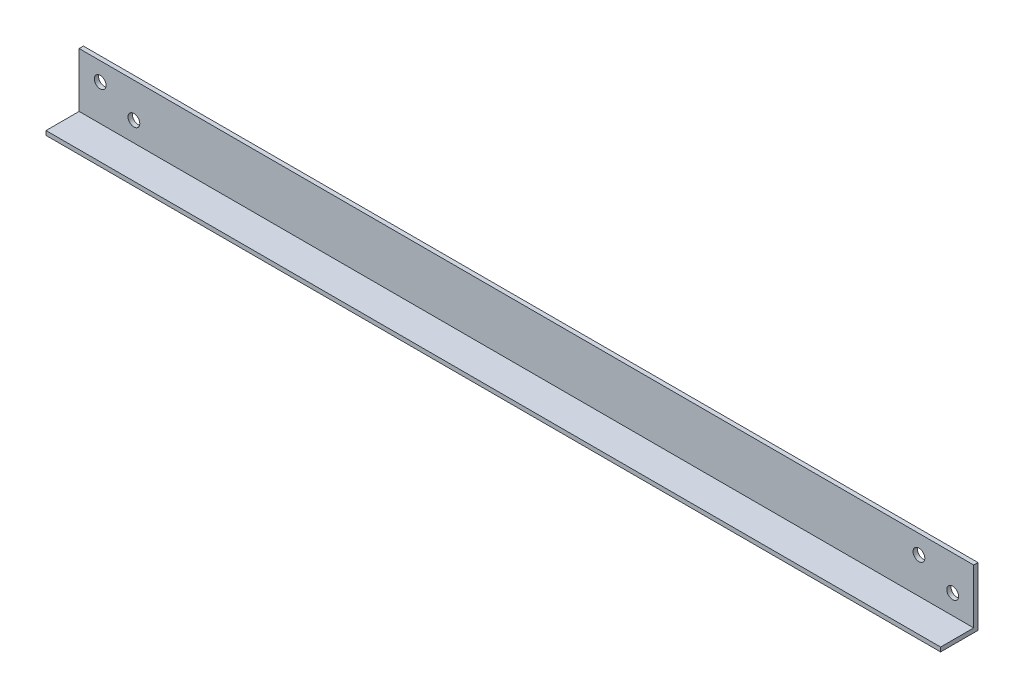
ISO-10303-21;
HEADER;
FILE_DESCRIPTION(('STEP AP214'),'2;1');
FILE_NAME('part.step','',(''),(''),'','','');
FILE_SCHEMA(('AUTOMOTIVE_DESIGN { 1 0 10303 214 1 1 1 1 }'));
ENDSEC;
DATA;
#1=APPLICATION_CONTEXT('core data for automotive mechanical design processes');
#2=APPLICATION_PROTOCOL_DEFINITION('international standard','automotive_design',2000,#1);
#3=PRODUCT_CONTEXT('',#1,'mechanical');
#4=PRODUCT('Part','Part','',(#3));
#5=PRODUCT_RELATED_PRODUCT_CATEGORY('part','',(#4));
#6=PRODUCT_DEFINITION_FORMATION('','',#4);
#7=PRODUCT_DEFINITION_CONTEXT('part definition',#1,'design');
#8=PRODUCT_DEFINITION('design','',#6,#7);
#9=PRODUCT_DEFINITION_SHAPE('','',#8);
#10=(LENGTH_UNIT() NAMED_UNIT(*) SI_UNIT(.MILLI.,.METRE.));
#11=(NAMED_UNIT(*) PLANE_ANGLE_UNIT() SI_UNIT($,.RADIAN.));
#12=(NAMED_UNIT(*) SI_UNIT($,.STERADIAN.) SOLID_ANGLE_UNIT());
#13=UNCERTAINTY_MEASURE_WITH_UNIT(LENGTH_MEASURE(1.E-05),#10,'distance_accuracy_value','');
#14=(GEOMETRIC_REPRESENTATION_CONTEXT(3) GLOBAL_UNCERTAINTY_ASSIGNED_CONTEXT((#13)) GLOBAL_UNIT_ASSIGNED_CONTEXT((#10,
#11,#12)) REPRESENTATION_CONTEXT('',''));
#15=CARTESIAN_POINT('',(0.,0.,0.));
#16=DIRECTION('',(0.,0.,1.));
#17=DIRECTION('',(1.,0.,0.));
#18=AXIS2_PLACEMENT_3D('',#15,#16,#17);
#19=CARTESIAN_POINT('',(0.,110.,8.));
#20=DIRECTION('',(0.,0.,-1.));
#21=DIRECTION('',(-1.,0.,0.));
#22=AXIS2_PLACEMENT_3D('',#19,#20,#21);
#23=PLANE('',#22);
#24=CARTESIAN_POINT('',(39.4252356846379,75.1641462070687,8.));
#25=DIRECTION('',(0.,0.,-1.));
#26=DIRECTION('',(-1.,0.,0.));
#27=AXIS2_PLACEMENT_3D('',#24,#25,#26);
#28=CIRCLE('',#27,11.);
#29=CARTESIAN_POINT('',(28.4252356846379,75.1641462070687,8.));
#30=VERTEX_POINT('',#29);
#31=EDGE_CURVE('E156',#30,#30,#28,.T.);
#32=ORIENTED_EDGE('',*,*,#31,.T.);
#33=EDGE_LOOP('',(#32));
#34=FACE_BOUND('',#33,.T.);
#35=CARTESIAN_POINT('',(102.592666245003,44.9999999999997,8.));
#36=DIRECTION('',(0.,0.,-1.));
#37=DIRECTION('',(-1.,0.,0.));
#38=AXIS2_PLACEMENT_3D('',#35,#36,#37);
#39=CIRCLE('',#38,11.);
#40=CARTESIAN_POINT('',(91.5926662450031,44.9999999999997,8.));
#41=VERTEX_POINT('',#40);
#42=EDGE_CURVE('E150',#41,#41,#39,.T.);
#43=ORIENTED_EDGE('',*,*,#42,.T.);
#44=EDGE_LOOP('',(#43));
#45=FACE_BOUND('',#44,.T.);
#46=CARTESIAN_POINT('',(1572.407333755,75.1641462070687,8.));
#47=DIRECTION('',(0.,0.,-1.));
#48=DIRECTION('',(-1.,0.,0.));
#49=AXIS2_PLACEMENT_3D('',#46,#47,#48);
#50=CIRCLE('',#49,10.9999999999999);
#51=CARTESIAN_POINT('',(1561.407333755,75.1641462070687,8.));
#52=VERTEX_POINT('',#51);
#53=EDGE_CURVE('E144',#52,#52,#50,.T.);
#54=ORIENTED_EDGE('',*,*,#53,.T.);
#55=EDGE_LOOP('',(#54));
#56=FACE_BOUND('',#55,.T.);
#57=CARTESIAN_POINT('',(1635.57476431536,44.9999999999997,8.));
#58=DIRECTION('',(0.,0.,-1.));
#59=DIRECTION('',(-1.,0.,0.));
#60=AXIS2_PLACEMENT_3D('',#57,#58,#59);
#61=CIRCLE('',#60,10.9999999999999);
#62=CARTESIAN_POINT('',(1624.57476431536,44.9999999999997,8.));
#63=VERTEX_POINT('',#62);
#64=EDGE_CURVE('E119',#63,#63,#61,.T.);
#65=ORIENTED_EDGE('',*,*,#64,.T.);
#66=EDGE_LOOP('',(#65));
#67=FACE_BOUND('',#66,.T.);
#68=DIRECTION('',(-1.,0.,0.));
#69=VECTOR('',#68,1.);
#70=CARTESIAN_POINT('',(0.,8.,8.));
#71=LINE('',#70,#69);
#72=CARTESIAN_POINT('',(1675.,8.,8.));
#73=VERTEX_POINT('',#72);
#74=CARTESIAN_POINT('',(0.,8.,8.));
#75=VERTEX_POINT('',#74);
#76=EDGE_CURVE('E48',#73,#75,#71,.T.);
#77=ORIENTED_EDGE('',*,*,#76,.F.);
#78=DIRECTION('',(0.,1.,0.));
#79=VECTOR('',#78,1.);
#80=CARTESIAN_POINT('',(1675.,0.,8.));
#81=LINE('',#80,#79);
#82=CARTESIAN_POINT('',(1675.,110.,8.));
#83=VERTEX_POINT('',#82);
#84=EDGE_CURVE('E108',#73,#83,#81,.T.);
#85=ORIENTED_EDGE('',*,*,#84,.T.);
#86=DIRECTION('',(-1.,0.,0.));
#87=VECTOR('',#86,1.);
#88=CARTESIAN_POINT('',(0.,110.,8.));
#89=LINE('',#88,#87);
#90=CARTESIAN_POINT('',(0.,110.,8.));
#91=VERTEX_POINT('',#90);
#92=EDGE_CURVE('E54',#83,#91,#89,.T.);
#93=ORIENTED_EDGE('',*,*,#92,.T.);
#94=DIRECTION('',(0.,-1.,0.));
#95=VECTOR('',#94,1.);
#96=CARTESIAN_POINT('',(0.,0.,8.));
#97=LINE('',#96,#95);
#98=EDGE_CURVE('E83',#91,#75,#97,.T.);
#99=ORIENTED_EDGE('',*,*,#98,.T.);
#100=EDGE_LOOP('',(#77,#85,#93,#99));
#101=FACE_BOUND('',#100,.T.);
#102=ADVANCED_FACE('F31',(#34,#45,#56,#67,#101),#23,.F.);
#103=CARTESIAN_POINT('',(0.,0.,8.));
#104=DIRECTION('',(1.,0.,0.));
#105=DIRECTION('',(0.,0.,-1.));
#106=AXIS2_PLACEMENT_3D('',#103,#104,#105);
#107=PLANE('',#106);
#108=DIRECTION('',(0.,-1.,0.));
#109=VECTOR('',#108,1.);
#110=CARTESIAN_POINT('',(0.,0.,0.));
#111=LINE('',#110,#109);
#112=CARTESIAN_POINT('',(0.,110.,0.));
#113=VERTEX_POINT('',#112);
#114=CARTESIAN_POINT('',(0.,0.,0.));
#115=VERTEX_POINT('',#114);
#116=EDGE_CURVE('E89',#113,#115,#111,.T.);
#117=ORIENTED_EDGE('',*,*,#116,.T.);
#118=DIRECTION('',(0.,0.,-1.));
#119=VECTOR('',#118,1.);
#120=CARTESIAN_POINT('',(0.,0.,8.));
#121=LINE('',#120,#119);
#122=CARTESIAN_POINT('',(0.,0.,70.));
#123=VERTEX_POINT('',#122);
#124=EDGE_CURVE('E11',#123,#115,#121,.T.);
#125=ORIENTED_EDGE('',*,*,#124,.F.);
#126=DIRECTION('',(0.,-1.,0.));
#127=VECTOR('',#126,1.);
#128=CARTESIAN_POINT('',(0.,0.,70.));
#129=LINE('',#128,#127);
#130=CARTESIAN_POINT('',(0.,8.,70.));
#131=VERTEX_POINT('',#130);
#132=EDGE_CURVE('E118',#131,#123,#129,.T.);
#133=ORIENTED_EDGE('',*,*,#132,.F.);
#134=DIRECTION('',(0.,0.,-1.));
#135=VECTOR('',#134,1.);
#136=CARTESIAN_POINT('',(0.,8.,70.));
#137=LINE('',#136,#135);
#138=EDGE_CURVE('E98',#131,#75,#137,.T.);
#139=ORIENTED_EDGE('',*,*,#138,.T.);
#140=ORIENTED_EDGE('',*,*,#98,.F.);
#141=DIRECTION('',(0.,0.,-1.));
#142=VECTOR('',#141,1.);
#143=CARTESIAN_POINT('',(0.,110.,8.));
#144=LINE('',#143,#142);
#145=EDGE_CURVE('E76',#91,#113,#144,.T.);
#146=ORIENTED_EDGE('',*,*,#145,.T.);
#147=EDGE_LOOP('',(#117,#125,#133,#139,#140,#146));
#148=FACE_BOUND('',#147,.T.);
#149=ADVANCED_FACE('F33',(#148),#107,.F.);
#150=CARTESIAN_POINT('',(0.,0.,8.));
#151=DIRECTION('',(0.,1.,0.));
#152=DIRECTION('',(0.,0.,1.));
#153=AXIS2_PLACEMENT_3D('',#150,#151,#152);
#154=PLANE('',#153);
#155=DIRECTION('',(1.,0.,0.));
#156=VECTOR('',#155,1.);
#157=CARTESIAN_POINT('',(0.,0.,0.));
#158=LINE('',#157,#156);
#159=CARTESIAN_POINT('',(1675.,0.,0.));
#160=VERTEX_POINT('',#159);
#161=EDGE_CURVE('E93',#115,#160,#158,.T.);
#162=ORIENTED_EDGE('',*,*,#161,.T.);
#163=DIRECTION('',(0.,0.,-1.));
#164=VECTOR('',#163,1.);
#165=CARTESIAN_POINT('',(1675.,0.,8.));
#166=LINE('',#165,#164);
#167=CARTESIAN_POINT('',(1675.,0.,70.));
#168=VERTEX_POINT('',#167);
#169=EDGE_CURVE('E40',#168,#160,#166,.T.);
#170=ORIENTED_EDGE('',*,*,#169,.F.);
#171=DIRECTION('',(1.,0.,0.));
#172=VECTOR('',#171,1.);
#173=CARTESIAN_POINT('',(0.,0.,70.));
#174=LINE('',#173,#172);
#175=EDGE_CURVE('E131',#123,#168,#174,.T.);
#176=ORIENTED_EDGE('',*,*,#175,.F.);
#177=ORIENTED_EDGE('',*,*,#124,.T.);
#178=EDGE_LOOP('',(#162,#170,#176,#177));
#179=FACE_BOUND('',#178,.T.);
#180=ADVANCED_FACE('F190',(#179),#154,.F.);
#181=CARTESIAN_POINT('',(1675.,0.,8.));
#182=DIRECTION('',(-1.,0.,0.));
#183=DIRECTION('',(0.,0.,1.));
#184=AXIS2_PLACEMENT_3D('',#181,#182,#183);
#185=PLANE('',#184);
#186=DIRECTION('',(0.,1.,0.));
#187=VECTOR('',#186,1.);
#188=CARTESIAN_POINT('',(1675.,0.,0.));
#189=LINE('',#188,#187);
#190=CARTESIAN_POINT('',(1675.,110.,0.));
#191=VERTEX_POINT('',#190);
#192=EDGE_CURVE('E84',#160,#191,#189,.T.);
#193=ORIENTED_EDGE('',*,*,#192,.T.);
#194=DIRECTION('',(0.,0.,-1.));
#195=VECTOR('',#194,1.);
#196=CARTESIAN_POINT('',(1675.,110.,8.));
#197=LINE('',#196,#195);
#198=EDGE_CURVE('E79',#83,#191,#197,.T.);
#199=ORIENTED_EDGE('',*,*,#198,.F.);
#200=ORIENTED_EDGE('',*,*,#84,.F.);
#201=DIRECTION('',(0.,0.,-1.));
#202=VECTOR('',#201,1.);
#203=CARTESIAN_POINT('',(1675.,8.,70.));
#204=LINE('',#203,#202);
#205=CARTESIAN_POINT('',(1675.,8.,70.));
#206=VERTEX_POINT('',#205);
#207=EDGE_CURVE('E94',#206,#73,#204,.T.);
#208=ORIENTED_EDGE('',*,*,#207,.F.);
#209=DIRECTION('',(0.,1.,0.));
#210=VECTOR('',#209,1.);
#211=CARTESIAN_POINT('',(1675.,0.,70.));
#212=LINE('',#211,#210);
#213=EDGE_CURVE('E126',#168,#206,#212,.T.);
#214=ORIENTED_EDGE('',*,*,#213,.F.);
#215=ORIENTED_EDGE('',*,*,#169,.T.);
#216=EDGE_LOOP('',(#193,#199,#200,#208,#214,#215));
#217=FACE_BOUND('',#216,.T.);
#218=ADVANCED_FACE('F197',(#217),#185,.F.);
#219=CARTESIAN_POINT('',(0.,110.,8.));
#220=DIRECTION('',(0.,-1.,0.));
#221=DIRECTION('',(0.,0.,-1.));
#222=AXIS2_PLACEMENT_3D('',#219,#220,#221);
#223=PLANE('',#222);
#224=DIRECTION('',(-1.,0.,0.));
#225=VECTOR('',#224,1.);
#226=CARTESIAN_POINT('',(0.,110.,0.));
#227=LINE('',#226,#225);
#228=EDGE_CURVE('E73',#191,#113,#227,.T.);
#229=ORIENTED_EDGE('',*,*,#228,.T.);
#230=ORIENTED_EDGE('',*,*,#145,.F.);
#231=ORIENTED_EDGE('',*,*,#92,.F.);
#232=ORIENTED_EDGE('',*,*,#198,.T.);
#233=EDGE_LOOP('',(#229,#230,#231,#232));
#234=FACE_BOUND('',#233,.T.);
#235=ADVANCED_FACE('F75',(#234),#223,.F.);
#236=CARTESIAN_POINT('',(0.,110.,0.));
#237=DIRECTION('',(0.,0.,-1.));
#238=DIRECTION('',(-1.,0.,0.));
#239=AXIS2_PLACEMENT_3D('',#236,#237,#238);
#240=PLANE('',#239);
#241=CARTESIAN_POINT('',(39.4252356846379,75.1641462070687,0.));
#242=DIRECTION('',(0.,0.,-1.));
#243=DIRECTION('',(-1.,0.,0.));
#244=AXIS2_PLACEMENT_3D('',#241,#242,#243);
#245=CIRCLE('',#244,11.);
#246=CARTESIAN_POINT('',(28.4252356846379,75.1641462070687,0.));
#247=VERTEX_POINT('',#246);
#248=EDGE_CURVE('E159',#247,#247,#245,.T.);
#249=ORIENTED_EDGE('',*,*,#248,.F.);
#250=EDGE_LOOP('',(#249));
#251=FACE_BOUND('',#250,.T.);
#252=CARTESIAN_POINT('',(102.592666245003,44.9999999999997,0.));
#253=DIRECTION('',(0.,0.,-1.));
#254=DIRECTION('',(-1.,0.,0.));
#255=AXIS2_PLACEMENT_3D('',#252,#253,#254);
#256=CIRCLE('',#255,11.);
#257=CARTESIAN_POINT('',(91.5926662450031,44.9999999999997,0.));
#258=VERTEX_POINT('',#257);
#259=EDGE_CURVE('E153',#258,#258,#256,.T.);
#260=ORIENTED_EDGE('',*,*,#259,.F.);
#261=EDGE_LOOP('',(#260));
#262=FACE_BOUND('',#261,.T.);
#263=CARTESIAN_POINT('',(1572.407333755,75.1641462070687,0.));
#264=DIRECTION('',(0.,0.,-1.));
#265=DIRECTION('',(-1.,0.,0.));
#266=AXIS2_PLACEMENT_3D('',#263,#264,#265);
#267=CIRCLE('',#266,10.9999999999999);
#268=CARTESIAN_POINT('',(1561.407333755,75.1641462070687,0.));
#269=VERTEX_POINT('',#268);
#270=EDGE_CURVE('E147',#269,#269,#267,.T.);
#271=ORIENTED_EDGE('',*,*,#270,.F.);
#272=EDGE_LOOP('',(#271));
#273=FACE_BOUND('',#272,.T.);
#274=CARTESIAN_POINT('',(1635.57476431536,44.9999999999997,0.));
#275=DIRECTION('',(0.,0.,-1.));
#276=DIRECTION('',(-1.,0.,0.));
#277=AXIS2_PLACEMENT_3D('',#274,#275,#276);
#278=CIRCLE('',#277,10.9999999999999);
#279=CARTESIAN_POINT('',(1624.57476431536,44.9999999999997,0.));
#280=VERTEX_POINT('',#279);
#281=EDGE_CURVE('E141',#280,#280,#278,.T.);
#282=ORIENTED_EDGE('',*,*,#281,.F.);
#283=EDGE_LOOP('',(#282));
#284=FACE_BOUND('',#283,.T.);
#285=ORIENTED_EDGE('',*,*,#116,.F.);
#286=ORIENTED_EDGE('',*,*,#228,.F.);
#287=ORIENTED_EDGE('',*,*,#192,.F.);
#288=ORIENTED_EDGE('',*,*,#161,.F.);
#289=EDGE_LOOP('',(#285,#286,#287,#288));
#290=FACE_BOUND('',#289,.T.);
#291=ADVANCED_FACE('F92',(#251,#262,#273,#284,#290),#240,.T.);
#292=CARTESIAN_POINT('',(0.,8.,70.));
#293=DIRECTION('',(0.,-1.,0.));
#294=DIRECTION('',(0.,0.,-1.));
#295=AXIS2_PLACEMENT_3D('',#292,#293,#294);
#296=PLANE('',#295);
#297=ORIENTED_EDGE('',*,*,#76,.T.);
#298=ORIENTED_EDGE('',*,*,#138,.F.);
#299=DIRECTION('',(-1.,0.,0.));
#300=VECTOR('',#299,1.);
#301=CARTESIAN_POINT('',(0.,8.,70.));
#302=LINE('',#301,#300);
#303=EDGE_CURVE('E115',#206,#131,#302,.T.);
#304=ORIENTED_EDGE('',*,*,#303,.F.);
#305=ORIENTED_EDGE('',*,*,#207,.T.);
#306=EDGE_LOOP('',(#297,#298,#304,#305));
#307=FACE_BOUND('',#306,.T.);
#308=ADVANCED_FACE('F168',(#307),#296,.F.);
#309=CARTESIAN_POINT('',(0.,8.,70.));
#310=DIRECTION('',(0.,0.,-1.));
#311=DIRECTION('',(-1.,0.,0.));
#312=AXIS2_PLACEMENT_3D('',#309,#310,#311);
#313=PLANE('',#312);
#314=ORIENTED_EDGE('',*,*,#132,.T.);
#315=ORIENTED_EDGE('',*,*,#175,.T.);
#316=ORIENTED_EDGE('',*,*,#213,.T.);
#317=ORIENTED_EDGE('',*,*,#303,.T.);
#318=EDGE_LOOP('',(#314,#315,#316,#317));
#319=FACE_BOUND('',#318,.T.);
#320=ADVANCED_FACE('F180',(#319),#313,.F.);
#321=CARTESIAN_POINT('',(1635.57476431536,44.9999999999997,70.000025));
#322=DIRECTION('',(0.,0.,-1.));
#323=DIRECTION('',(-1.,0.,0.));
#324=AXIS2_PLACEMENT_3D('',#321,#322,#323);
#325=CYLINDRICAL_SURFACE('',#324,10.9999999999999);
#326=ORIENTED_EDGE('',*,*,#281,.T.);
#327=EDGE_LOOP('',(#326));
#328=FACE_BOUND('',#327,.T.);
#329=ORIENTED_EDGE('',*,*,#64,.F.);
#330=EDGE_LOOP('',(#329));
#331=FACE_BOUND('',#330,.T.);
#332=ADVANCED_FACE('F176',(#328,#331),#325,.F.);
#333=CARTESIAN_POINT('',(1572.407333755,75.1641462070687,70.000025));
#334=DIRECTION('',(0.,0.,-1.));
#335=DIRECTION('',(-1.,0.,0.));
#336=AXIS2_PLACEMENT_3D('',#333,#334,#335);
#337=CYLINDRICAL_SURFACE('',#336,10.9999999999999);
#338=ORIENTED_EDGE('',*,*,#270,.T.);
#339=EDGE_LOOP('',(#338));
#340=FACE_BOUND('',#339,.T.);
#341=ORIENTED_EDGE('',*,*,#53,.F.);
#342=EDGE_LOOP('',(#341));
#343=FACE_BOUND('',#342,.T.);
#344=ADVANCED_FACE('F179',(#340,#343),#337,.F.);
#345=CARTESIAN_POINT('',(102.592666245003,44.9999999999997,70.000025));
#346=DIRECTION('',(0.,0.,-1.));
#347=DIRECTION('',(-1.,0.,0.));
#348=AXIS2_PLACEMENT_3D('',#345,#346,#347);
#349=CYLINDRICAL_SURFACE('',#348,11.);
#350=ORIENTED_EDGE('',*,*,#259,.T.);
#351=EDGE_LOOP('',(#350));
#352=FACE_BOUND('',#351,.T.);
#353=ORIENTED_EDGE('',*,*,#42,.F.);
#354=EDGE_LOOP('',(#353));
#355=FACE_BOUND('',#354,.T.);
#356=ADVANCED_FACE('F220',(#352,#355),#349,.F.);
#357=CARTESIAN_POINT('',(39.4252356846379,75.1641462070687,70.000025));
#358=DIRECTION('',(0.,0.,-1.));
#359=DIRECTION('',(-1.,0.,0.));
#360=AXIS2_PLACEMENT_3D('',#357,#358,#359);
#361=CYLINDRICAL_SURFACE('',#360,11.);
#362=ORIENTED_EDGE('',*,*,#248,.T.);
#363=EDGE_LOOP('',(#362));
#364=FACE_BOUND('',#363,.T.);
#365=ORIENTED_EDGE('',*,*,#31,.F.);
#366=EDGE_LOOP('',(#365));
#367=FACE_BOUND('',#366,.T.);
#368=ADVANCED_FACE('F163',(#364,#367),#361,.F.);
#369=CLOSED_SHELL('',(#102,#149,#180,#218,#235,#291,#308,#320,#332,#344,#356,#368));
#370=MANIFOLD_SOLID_BREP('B2',#369);
#371=ADVANCED_BREP_SHAPE_REPRESENTATION('',(#18,#370),#14);
#372=SHAPE_DEFINITION_REPRESENTATION(#9,#371);
ENDSEC;
END-ISO-10303-21;
